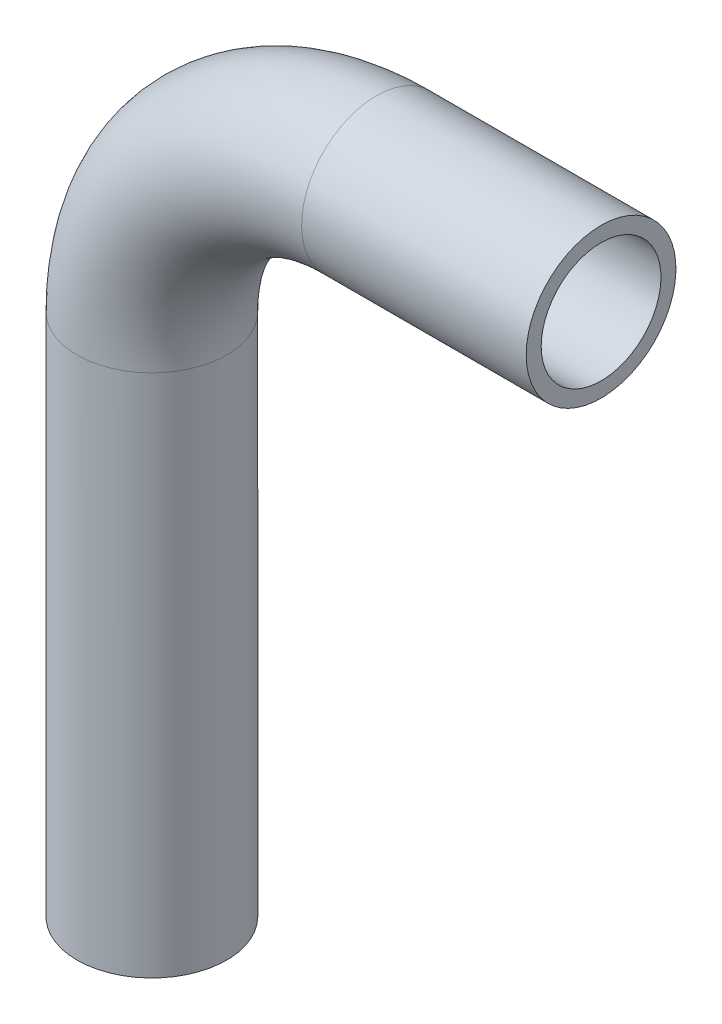
ISO-10303-21;
HEADER;
FILE_DESCRIPTION(('STEP AP214'),'2;1');
FILE_NAME('part.step','',(''),(''),'','','');
FILE_SCHEMA(('AUTOMOTIVE_DESIGN { 1 0 10303 214 1 1 1 1 }'));
ENDSEC;
DATA;
#1=APPLICATION_CONTEXT('core data for automotive mechanical design processes');
#2=APPLICATION_PROTOCOL_DEFINITION('international standard','automotive_design',2000,#1);
#3=PRODUCT_CONTEXT('',#1,'mechanical');
#4=PRODUCT('Part','Part','',(#3));
#5=PRODUCT_RELATED_PRODUCT_CATEGORY('part','',(#4));
#6=PRODUCT_DEFINITION_FORMATION('','',#4);
#7=PRODUCT_DEFINITION_CONTEXT('part definition',#1,'design');
#8=PRODUCT_DEFINITION('design','',#6,#7);
#9=PRODUCT_DEFINITION_SHAPE('','',#8);
#10=(LENGTH_UNIT() NAMED_UNIT(*) SI_UNIT(.MILLI.,.METRE.));
#11=(NAMED_UNIT(*) PLANE_ANGLE_UNIT() SI_UNIT($,.RADIAN.));
#12=(NAMED_UNIT(*) SI_UNIT($,.STERADIAN.) SOLID_ANGLE_UNIT());
#13=UNCERTAINTY_MEASURE_WITH_UNIT(LENGTH_MEASURE(1.E-05),#10,'distance_accuracy_value','');
#14=(GEOMETRIC_REPRESENTATION_CONTEXT(3) GLOBAL_UNCERTAINTY_ASSIGNED_CONTEXT((#13)) GLOBAL_UNIT_ASSIGNED_CONTEXT((#10,
#11,#12)) REPRESENTATION_CONTEXT('',''));
#15=CARTESIAN_POINT('',(0.,0.,0.));
#16=DIRECTION('',(0.,0.,1.));
#17=DIRECTION('',(1.,0.,0.));
#18=AXIS2_PLACEMENT_3D('',#15,#16,#17);
#19=CARTESIAN_POINT('',(38.1,127.,0.));
#20=DIRECTION('',(1.,0.,0.));
#21=DIRECTION('',(0.,0.,-1.));
#22=AXIS2_PLACEMENT_3D('',#19,#20,#21);
#23=CYLINDRICAL_SURFACE('',#22,12.7);
#24=CARTESIAN_POINT('',(38.1,127.,0.));
#25=DIRECTION('',(1.,0.,0.));
#26=DIRECTION('',(0.,0.,1.));
#27=AXIS2_PLACEMENT_3D('',#24,#25,#26);
#28=CIRCLE('',#27,12.7);
#29=CARTESIAN_POINT('',(38.1,139.7,0.));
#30=VERTEX_POINT('',#29);
#31=EDGE_CURVE('E47',#30,#30,#28,.T.);
#32=ORIENTED_EDGE('',*,*,#31,.T.);
#33=EDGE_LOOP('',(#32));
#34=FACE_BOUND('',#33,.T.);
#35=CARTESIAN_POINT('',(76.2,127.,0.));
#36=DIRECTION('',(1.,0.,0.));
#37=DIRECTION('',(0.,0.,1.));
#38=AXIS2_PLACEMENT_3D('',#35,#36,#37);
#39=CIRCLE('',#38,12.7);
#40=CARTESIAN_POINT('',(76.2,127.,12.7));
#41=VERTEX_POINT('',#40);
#42=EDGE_CURVE('E10',#41,#41,#39,.T.);
#43=ORIENTED_EDGE('',*,*,#42,.F.);
#44=EDGE_LOOP('',(#43));
#45=FACE_BOUND('',#44,.T.);
#46=ADVANCED_FACE('F37',(#34,#45),#23,.T.);
#47=CARTESIAN_POINT('',(38.1,127.,0.));
#48=DIRECTION('',(1.,0.,0.));
#49=DIRECTION('',(0.,0.,-1.));
#50=AXIS2_PLACEMENT_3D('',#47,#48,#49);
#51=CYLINDRICAL_SURFACE('',#50,10.16);
#52=CARTESIAN_POINT('',(38.1,127.,0.));
#53=DIRECTION('',(1.,0.,0.));
#54=DIRECTION('',(0.,0.,1.));
#55=AXIS2_PLACEMENT_3D('',#52,#53,#54);
#56=CIRCLE('',#55,10.16);
#57=CARTESIAN_POINT('',(38.1,137.16,0.));
#58=VERTEX_POINT('',#57);
#59=EDGE_CURVE('E51',#58,#58,#56,.T.);
#60=ORIENTED_EDGE('',*,*,#59,.F.);
#61=EDGE_LOOP('',(#60));
#62=FACE_BOUND('',#61,.T.);
#63=CARTESIAN_POINT('',(76.2,127.,0.));
#64=DIRECTION('',(1.,0.,0.));
#65=DIRECTION('',(0.,0.,1.));
#66=AXIS2_PLACEMENT_3D('',#63,#64,#65);
#67=CIRCLE('',#66,10.16);
#68=CARTESIAN_POINT('',(76.2,127.,10.16));
#69=VERTEX_POINT('',#68);
#70=EDGE_CURVE('E43',#69,#69,#67,.T.);
#71=ORIENTED_EDGE('',*,*,#70,.T.);
#72=EDGE_LOOP('',(#71));
#73=FACE_BOUND('',#72,.T.);
#74=ADVANCED_FACE('F79',(#62,#73),#51,.F.);
#75=CARTESIAN_POINT('',(38.1,88.9,0.));
#76=DIRECTION('',(0.,0.,-1.));
#77=DIRECTION('',(-1.,0.,0.));
#78=AXIS2_PLACEMENT_3D('',#75,#76,#77);
#79=TOROIDAL_SURFACE('',#78,38.1,12.7);
#80=CARTESIAN_POINT('',(0.,88.9,0.));
#81=DIRECTION('',(0.,1.,0.));
#82=DIRECTION('',(0.,0.,1.));
#83=AXIS2_PLACEMENT_3D('',#80,#81,#82);
#84=CIRCLE('',#83,12.7);
#85=CARTESIAN_POINT('',(-12.7,88.9,0.));
#86=VERTEX_POINT('',#85);
#87=EDGE_CURVE('E56',#86,#86,#84,.T.);
#88=CARTESIAN_POINT('',(38.1,88.9,0.));
#89=DIRECTION('',(0.,0.,-1.));
#90=DIRECTION('',(-1.,0.,0.));
#91=AXIS2_PLACEMENT_3D('',#88,#89,#90);
#92=CIRCLE('',#91,50.8);
#93=EDGE_CURVE('',#86,#30,#92,.T.);
#94=ORIENTED_EDGE('',*,*,#87,.T.);
#95=ORIENTED_EDGE('',*,*,#31,.F.);
#96=ORIENTED_EDGE('',*,*,#93,.T.);
#97=ORIENTED_EDGE('',*,*,#93,.F.);
#98=EDGE_LOOP('',(#94,#96,#95,#97));
#99=FACE_BOUND('',#98,.T.);
#100=ADVANCED_FACE('F75',(#99),#79,.T.);
#101=CARTESIAN_POINT('',(38.1,88.9,0.));
#102=DIRECTION('',(0.,0.,-1.));
#103=DIRECTION('',(-1.,0.,0.));
#104=AXIS2_PLACEMENT_3D('',#101,#102,#103);
#105=TOROIDAL_SURFACE('',#104,38.1,10.16);
#106=CARTESIAN_POINT('',(0.,88.9,0.));
#107=DIRECTION('',(0.,1.,0.));
#108=DIRECTION('',(0.,0.,1.));
#109=AXIS2_PLACEMENT_3D('',#106,#107,#108);
#110=CIRCLE('',#109,10.16);
#111=CARTESIAN_POINT('',(-10.16,88.9,0.));
#112=VERTEX_POINT('',#111);
#113=EDGE_CURVE('E60',#112,#112,#110,.T.);
#114=CARTESIAN_POINT('',(38.1,88.9,0.));
#115=DIRECTION('',(0.,0.,-1.));
#116=DIRECTION('',(-1.,0.,0.));
#117=AXIS2_PLACEMENT_3D('',#114,#115,#116);
#118=CIRCLE('',#117,48.26);
#119=EDGE_CURVE('',#112,#58,#118,.T.);
#120=ORIENTED_EDGE('',*,*,#113,.F.);
#121=ORIENTED_EDGE('',*,*,#59,.T.);
#122=ORIENTED_EDGE('',*,*,#119,.T.);
#123=ORIENTED_EDGE('',*,*,#119,.F.);
#124=EDGE_LOOP('',(#120,#122,#121,#123));
#125=FACE_BOUND('',#124,.T.);
#126=ADVANCED_FACE('F72',(#125),#105,.F.);
#127=CARTESIAN_POINT('',(0.,88.9,0.));
#128=DIRECTION('',(0.,-1.,0.));
#129=DIRECTION('',(0.,0.,-1.));
#130=AXIS2_PLACEMENT_3D('',#127,#128,#129);
#131=CYLINDRICAL_SURFACE('',#130,10.16);
#132=ORIENTED_EDGE('',*,*,#113,.T.);
#133=EDGE_LOOP('',(#132));
#134=FACE_BOUND('',#133,.T.);
#135=CARTESIAN_POINT('',(0.,0.,0.));
#136=DIRECTION('',(0.,1.,0.));
#137=DIRECTION('',(0.,0.,1.));
#138=AXIS2_PLACEMENT_3D('',#135,#136,#137);
#139=CIRCLE('',#138,10.16);
#140=CARTESIAN_POINT('',(0.,0.,10.16));
#141=VERTEX_POINT('',#140);
#142=EDGE_CURVE('E61',#141,#141,#139,.T.);
#143=ORIENTED_EDGE('',*,*,#142,.F.);
#144=EDGE_LOOP('',(#143));
#145=FACE_BOUND('',#144,.T.);
#146=ADVANCED_FACE('F69',(#134,#145),#131,.F.);
#147=CARTESIAN_POINT('',(0.,88.9,0.));
#148=DIRECTION('',(0.,-1.,0.));
#149=DIRECTION('',(0.,0.,-1.));
#150=AXIS2_PLACEMENT_3D('',#147,#148,#149);
#151=CYLINDRICAL_SURFACE('',#150,12.7);
#152=ORIENTED_EDGE('',*,*,#87,.F.);
#153=EDGE_LOOP('',(#152));
#154=FACE_BOUND('',#153,.T.);
#155=CARTESIAN_POINT('',(0.,0.,0.));
#156=DIRECTION('',(0.,1.,0.));
#157=DIRECTION('',(0.,0.,1.));
#158=AXIS2_PLACEMENT_3D('',#155,#156,#157);
#159=CIRCLE('',#158,12.7);
#160=CARTESIAN_POINT('',(0.,0.,12.7));
#161=VERTEX_POINT('',#160);
#162=EDGE_CURVE('E57',#161,#161,#159,.T.);
#163=ORIENTED_EDGE('',*,*,#162,.T.);
#164=EDGE_LOOP('',(#163));
#165=FACE_BOUND('',#164,.T.);
#166=ADVANCED_FACE('F91',(#154,#165),#151,.T.);
#167=CARTESIAN_POINT('',(76.2,127.,0.));
#168=DIRECTION('',(1.,0.,0.));
#169=DIRECTION('',(0.,0.,1.));
#170=AXIS2_PLACEMENT_3D('',#167,#168,#169);
#171=PLANE('',#170);
#172=ORIENTED_EDGE('',*,*,#70,.F.);
#173=EDGE_LOOP('',(#172));
#174=FACE_BOUND('',#173,.T.);
#175=ORIENTED_EDGE('',*,*,#42,.T.);
#176=EDGE_LOOP('',(#175));
#177=FACE_BOUND('',#176,.T.);
#178=ADVANCED_FACE('F94',(#174,#177),#171,.T.);
#179=CARTESIAN_POINT('',(0.,0.,0.));
#180=DIRECTION('',(0.,1.,0.));
#181=DIRECTION('',(0.,0.,1.));
#182=AXIS2_PLACEMENT_3D('',#179,#180,#181);
#183=PLANE('',#182);
#184=ORIENTED_EDGE('',*,*,#142,.T.);
#185=EDGE_LOOP('',(#184));
#186=FACE_BOUND('',#185,.T.);
#187=ORIENTED_EDGE('',*,*,#162,.F.);
#188=EDGE_LOOP('',(#187));
#189=FACE_BOUND('',#188,.T.);
#190=ADVANCED_FACE('F96',(#186,#189),#183,.F.);
#191=CLOSED_SHELL('',(#46,#74,#100,#126,#146,#166,#178,#190));
#192=MANIFOLD_SOLID_BREP('B2',#191);
#193=ADVANCED_BREP_SHAPE_REPRESENTATION('',(#18,#192),#14);
#194=SHAPE_DEFINITION_REPRESENTATION(#9,#193);
ENDSEC;
END-ISO-10303-21;
